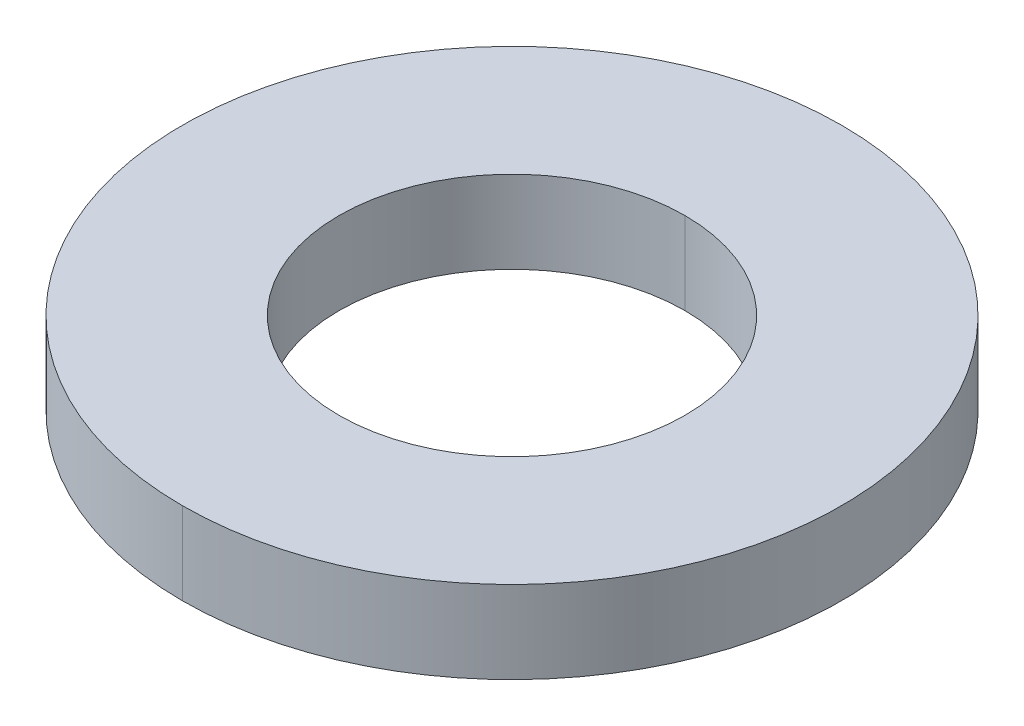
ISO-10303-21;
HEADER;
FILE_DESCRIPTION(('STEP AP214'),'2;1');
FILE_NAME('part.step','',(''),(''),'','','');
FILE_SCHEMA(('AUTOMOTIVE_DESIGN { 1 0 10303 214 1 1 1 1 }'));
ENDSEC;
DATA;
#1=APPLICATION_CONTEXT('core data for automotive mechanical design processes');
#2=APPLICATION_PROTOCOL_DEFINITION('international standard','automotive_design',2000,#1);
#3=PRODUCT_CONTEXT('',#1,'mechanical');
#4=PRODUCT('Part','Part','',(#3));
#5=PRODUCT_RELATED_PRODUCT_CATEGORY('part','',(#4));
#6=PRODUCT_DEFINITION_FORMATION('','',#4);
#7=PRODUCT_DEFINITION_CONTEXT('part definition',#1,'design');
#8=PRODUCT_DEFINITION('design','',#6,#7);
#9=PRODUCT_DEFINITION_SHAPE('','',#8);
#10=(LENGTH_UNIT() NAMED_UNIT(*) SI_UNIT(.MILLI.,.METRE.));
#11=(NAMED_UNIT(*) PLANE_ANGLE_UNIT() SI_UNIT($,.RADIAN.));
#12=(NAMED_UNIT(*) SI_UNIT($,.STERADIAN.) SOLID_ANGLE_UNIT());
#13=UNCERTAINTY_MEASURE_WITH_UNIT(LENGTH_MEASURE(1.E-05),#10,'distance_accuracy_value','');
#14=(GEOMETRIC_REPRESENTATION_CONTEXT(3) GLOBAL_UNCERTAINTY_ASSIGNED_CONTEXT((#13)) GLOBAL_UNIT_ASSIGNED_CONTEXT((#10,
#11,#12)) REPRESENTATION_CONTEXT('',''));
#15=CARTESIAN_POINT('',(0.,0.,0.));
#16=DIRECTION('',(0.,0.,1.));
#17=DIRECTION('',(1.,0.,0.));
#18=AXIS2_PLACEMENT_3D('',#15,#16,#17);
#19=CARTESIAN_POINT('',(0.,0.,0.));
#20=DIRECTION('',(0.,1.,0.));
#21=DIRECTION('',(0.,0.,1.));
#22=AXIS2_PLACEMENT_3D('',#19,#20,#21);
#23=PLANE('',#22);
#24=CARTESIAN_POINT('',(0.,0.,0.));
#25=DIRECTION('',(0.,-1.,0.));
#26=DIRECTION('',(0.,0.,-1.));
#27=AXIS2_PLACEMENT_3D('',#24,#25,#26);
#28=CIRCLE('',#27,4.);
#29=CARTESIAN_POINT('',(0.,0.,4.));
#30=VERTEX_POINT('',#29);
#31=CARTESIAN_POINT('',(0.,0.,-4.));
#32=VERTEX_POINT('',#31);
#33=EDGE_CURVE('E74',#30,#32,#28,.F.);
#34=ORIENTED_EDGE('',*,*,#33,.F.);
#35=CARTESIAN_POINT('',(0.,0.,0.));
#36=DIRECTION('',(0.,-1.,0.));
#37=DIRECTION('',(0.,0.,-1.));
#38=AXIS2_PLACEMENT_3D('',#35,#36,#37);
#39=CIRCLE('',#38,4.);
#40=EDGE_CURVE('E70',#32,#30,#39,.F.);
#41=ORIENTED_EDGE('',*,*,#40,.F.);
#42=EDGE_LOOP('',(#34,#41));
#43=FACE_BOUND('',#42,.T.);
#44=CARTESIAN_POINT('',(0.,0.,0.));
#45=DIRECTION('',(0.,-1.,0.));
#46=DIRECTION('',(0.,0.,-1.));
#47=AXIS2_PLACEMENT_3D('',#44,#45,#46);
#48=CIRCLE('',#47,2.1);
#49=CARTESIAN_POINT('',(0.,0.,2.1));
#50=VERTEX_POINT('',#49);
#51=CARTESIAN_POINT('',(0.,0.,-2.1));
#52=VERTEX_POINT('',#51);
#53=EDGE_CURVE('E20',#50,#52,#48,.F.);
#54=ORIENTED_EDGE('',*,*,#53,.T.);
#55=CARTESIAN_POINT('',(0.,0.,0.));
#56=DIRECTION('',(0.,-1.,0.));
#57=DIRECTION('',(0.,0.,-1.));
#58=AXIS2_PLACEMENT_3D('',#55,#56,#57);
#59=CIRCLE('',#58,2.1);
#60=EDGE_CURVE('E54',#52,#50,#59,.F.);
#61=ORIENTED_EDGE('',*,*,#60,.T.);
#62=EDGE_LOOP('',(#54,#61));
#63=FACE_BOUND('',#62,.T.);
#64=ADVANCED_FACE('F17',(#43,#63),#23,.F.);
#65=CARTESIAN_POINT('',(0.,1.,0.));
#66=DIRECTION('',(0.,-1.,0.));
#67=DIRECTION('',(0.,0.,-1.));
#68=AXIS2_PLACEMENT_3D('',#65,#66,#67);
#69=CYLINDRICAL_SURFACE('',#68,2.1);
#70=CARTESIAN_POINT('',(0.,1.,0.));
#71=DIRECTION('',(0.,-1.,0.));
#72=DIRECTION('',(0.,0.,-1.));
#73=AXIS2_PLACEMENT_3D('',#70,#71,#72);
#74=CIRCLE('',#73,2.1);
#75=CARTESIAN_POINT('',(0.,1.,-2.1));
#76=VERTEX_POINT('',#75);
#77=CARTESIAN_POINT('',(0.,1.,2.1));
#78=VERTEX_POINT('',#77);
#79=EDGE_CURVE('E63',#76,#78,#74,.T.);
#80=ORIENTED_EDGE('',*,*,#79,.F.);
#81=DIRECTION('',(0.,-1.,0.));
#82=VECTOR('',#81,1.);
#83=CARTESIAN_POINT('',(0.,1.,-2.1));
#84=LINE('',#83,#82);
#85=EDGE_CURVE('E59',#76,#52,#84,.T.);
#86=ORIENTED_EDGE('',*,*,#85,.T.);
#87=ORIENTED_EDGE('',*,*,#53,.F.);
#88=DIRECTION('',(0.,-1.,0.));
#89=VECTOR('',#88,1.);
#90=CARTESIAN_POINT('',(0.,1.,2.1));
#91=LINE('',#90,#89);
#92=EDGE_CURVE('E69',#50,#78,#91,.F.);
#93=ORIENTED_EDGE('',*,*,#92,.T.);
#94=EDGE_LOOP('',(#80,#86,#87,#93));
#95=FACE_BOUND('',#94,.T.);
#96=ADVANCED_FACE('F61',(#95),#69,.F.);
#97=CARTESIAN_POINT('',(0.,1.,0.));
#98=DIRECTION('',(0.,-1.,0.));
#99=DIRECTION('',(0.,0.,-1.));
#100=AXIS2_PLACEMENT_3D('',#97,#98,#99);
#101=CYLINDRICAL_SURFACE('',#100,2.1);
#102=ORIENTED_EDGE('',*,*,#92,.F.);
#103=ORIENTED_EDGE('',*,*,#60,.F.);
#104=ORIENTED_EDGE('',*,*,#85,.F.);
#105=CARTESIAN_POINT('',(0.,1.,0.));
#106=DIRECTION('',(0.,-1.,0.));
#107=DIRECTION('',(0.,0.,-1.));
#108=AXIS2_PLACEMENT_3D('',#105,#106,#107);
#109=CIRCLE('',#108,2.1);
#110=EDGE_CURVE('E79',#78,#76,#109,.T.);
#111=ORIENTED_EDGE('',*,*,#110,.F.);
#112=EDGE_LOOP('',(#102,#103,#104,#111));
#113=FACE_BOUND('',#112,.T.);
#114=ADVANCED_FACE('F68',(#113),#101,.F.);
#115=CARTESIAN_POINT('',(0.,1.,0.));
#116=DIRECTION('',(0.,-1.,0.));
#117=DIRECTION('',(0.,0.,-1.));
#118=AXIS2_PLACEMENT_3D('',#115,#116,#117);
#119=CYLINDRICAL_SURFACE('',#118,4.);
#120=DIRECTION('',(0.,-1.,0.));
#121=VECTOR('',#120,1.);
#122=CARTESIAN_POINT('',(0.,1.,-4.));
#123=LINE('',#122,#121);
#124=CARTESIAN_POINT('',(0.,1.,-4.));
#125=VERTEX_POINT('',#124);
#126=EDGE_CURVE('E77',#32,#125,#123,.F.);
#127=ORIENTED_EDGE('',*,*,#126,.F.);
#128=ORIENTED_EDGE('',*,*,#40,.T.);
#129=DIRECTION('',(0.,-1.,0.));
#130=VECTOR('',#129,1.);
#131=CARTESIAN_POINT('',(0.,1.,4.));
#132=LINE('',#131,#130);
#133=CARTESIAN_POINT('',(0.,1.,4.));
#134=VERTEX_POINT('',#133);
#135=EDGE_CURVE('E35',#134,#30,#132,.T.);
#136=ORIENTED_EDGE('',*,*,#135,.F.);
#137=CARTESIAN_POINT('',(0.,1.,0.));
#138=DIRECTION('',(0.,-1.,0.));
#139=DIRECTION('',(0.,0.,-1.));
#140=AXIS2_PLACEMENT_3D('',#137,#138,#139);
#141=CIRCLE('',#140,4.);
#142=EDGE_CURVE('E26',#125,#134,#141,.F.);
#143=ORIENTED_EDGE('',*,*,#142,.F.);
#144=EDGE_LOOP('',(#127,#128,#136,#143));
#145=FACE_BOUND('',#144,.T.);
#146=ADVANCED_FACE('F92',(#145),#119,.T.);
#147=CARTESIAN_POINT('',(0.,1.,0.));
#148=DIRECTION('',(0.,-1.,0.));
#149=DIRECTION('',(0.,0.,-1.));
#150=AXIS2_PLACEMENT_3D('',#147,#148,#149);
#151=CYLINDRICAL_SURFACE('',#150,4.);
#152=ORIENTED_EDGE('',*,*,#33,.T.);
#153=ORIENTED_EDGE('',*,*,#126,.T.);
#154=CARTESIAN_POINT('',(0.,1.,0.));
#155=DIRECTION('',(0.,-1.,0.));
#156=DIRECTION('',(0.,0.,-1.));
#157=AXIS2_PLACEMENT_3D('',#154,#155,#156);
#158=CIRCLE('',#157,4.);
#159=EDGE_CURVE('E11',#134,#125,#158,.F.);
#160=ORIENTED_EDGE('',*,*,#159,.F.);
#161=ORIENTED_EDGE('',*,*,#135,.T.);
#162=EDGE_LOOP('',(#152,#153,#160,#161));
#163=FACE_BOUND('',#162,.T.);
#164=ADVANCED_FACE('F87',(#163),#151,.T.);
#165=CARTESIAN_POINT('',(0.,1.,0.));
#166=DIRECTION('',(0.,1.,0.));
#167=DIRECTION('',(0.,0.,1.));
#168=AXIS2_PLACEMENT_3D('',#165,#166,#167);
#169=PLANE('',#168);
#170=ORIENTED_EDGE('',*,*,#142,.T.);
#171=ORIENTED_EDGE('',*,*,#159,.T.);
#172=EDGE_LOOP('',(#170,#171));
#173=FACE_BOUND('',#172,.T.);
#174=ORIENTED_EDGE('',*,*,#79,.T.);
#175=ORIENTED_EDGE('',*,*,#110,.T.);
#176=EDGE_LOOP('',(#174,#175));
#177=FACE_BOUND('',#176,.T.);
#178=ADVANCED_FACE('F90',(#173,#177),#169,.T.);
#179=CLOSED_SHELL('',(#64,#96,#114,#146,#164,#178));
#180=MANIFOLD_SOLID_BREP('B1',#179);
#181=ADVANCED_BREP_SHAPE_REPRESENTATION('',(#18,#180),#14);
#182=SHAPE_DEFINITION_REPRESENTATION(#9,#181);
ENDSEC;
END-ISO-10303-21;
